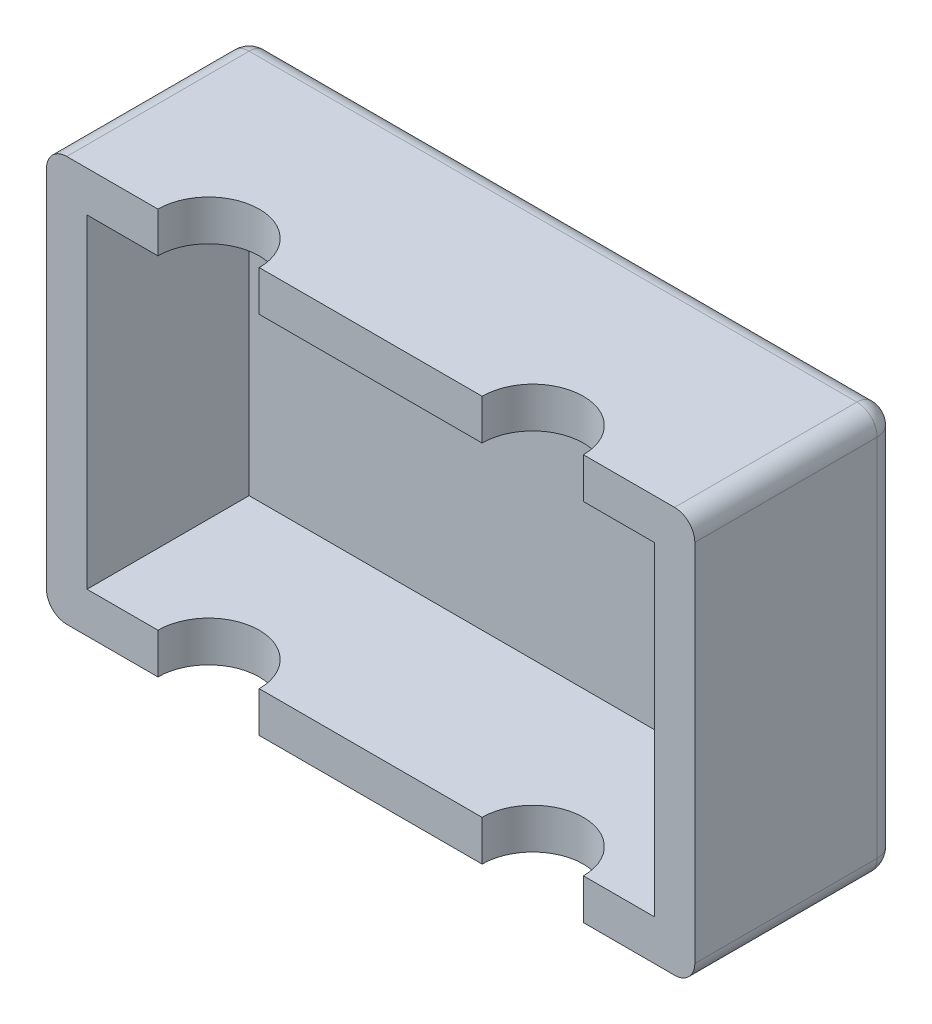
ISO-10303-21;
HEADER;
FILE_DESCRIPTION(('STEP AP214'),'2;1');
FILE_NAME('part.step','',(''),(''),'','','');
FILE_SCHEMA(('AUTOMOTIVE_DESIGN { 1 0 10303 214 1 1 1 1 }'));
ENDSEC;
DATA;
#1=APPLICATION_CONTEXT('core data for automotive mechanical design processes');
#2=APPLICATION_PROTOCOL_DEFINITION('international standard','automotive_design',2000,#1);
#3=PRODUCT_CONTEXT('',#1,'mechanical');
#4=PRODUCT('Part','Part','',(#3));
#5=PRODUCT_RELATED_PRODUCT_CATEGORY('part','',(#4));
#6=PRODUCT_DEFINITION_FORMATION('','',#4);
#7=PRODUCT_DEFINITION_CONTEXT('part definition',#1,'design');
#8=PRODUCT_DEFINITION('design','',#6,#7);
#9=PRODUCT_DEFINITION_SHAPE('','',#8);
#10=(LENGTH_UNIT() NAMED_UNIT(*) SI_UNIT(.MILLI.,.METRE.));
#11=(NAMED_UNIT(*) PLANE_ANGLE_UNIT() SI_UNIT($,.RADIAN.));
#12=(NAMED_UNIT(*) SI_UNIT($,.STERADIAN.) SOLID_ANGLE_UNIT());
#13=UNCERTAINTY_MEASURE_WITH_UNIT(LENGTH_MEASURE(1.E-05),#10,'distance_accuracy_value','');
#14=(GEOMETRIC_REPRESENTATION_CONTEXT(3) GLOBAL_UNCERTAINTY_ASSIGNED_CONTEXT((#13)) GLOBAL_UNIT_ASSIGNED_CONTEXT((#10,
#11,#12)) REPRESENTATION_CONTEXT('',''));
#15=CARTESIAN_POINT('',(0.,0.,0.));
#16=DIRECTION('',(0.,0.,1.));
#17=DIRECTION('',(1.,0.,0.));
#18=AXIS2_PLACEMENT_3D('',#15,#16,#17);
#19=CARTESIAN_POINT('',(-30.,-18.,20.));
#20=DIRECTION('',(0.,0.,1.));
#21=DIRECTION('',(1.,0.,0.));
#22=AXIS2_PLACEMENT_3D('',#19,#20,#21);
#23=PLANE('',#22);
#24=DIRECTION('',(0.,1.,0.));
#25=VECTOR('',#24,1.);
#26=CARTESIAN_POINT('',(21.,-20.,20.));
#27=LINE('',#26,#25);
#28=CARTESIAN_POINT('',(21.,-20.,20.));
#29=VERTEX_POINT('',#28);
#30=CARTESIAN_POINT('',(21.,-16.,20.));
#31=VERTEX_POINT('',#30);
#32=EDGE_CURVE('E48',#29,#31,#27,.T.);
#33=ORIENTED_EDGE('',*,*,#32,.F.);
#34=DIRECTION('',(1.,0.,0.));
#35=VECTOR('',#34,1.);
#36=CARTESIAN_POINT('',(-30.,-20.,20.));
#37=LINE('',#36,#35);
#38=CARTESIAN_POINT('',(30.,-20.,20.));
#39=VERTEX_POINT('',#38);
#40=EDGE_CURVE('E191',#29,#39,#37,.T.);
#41=ORIENTED_EDGE('',*,*,#40,.T.);
#42=CARTESIAN_POINT('',(30.,-18.,20.));
#43=DIRECTION('',(0.,0.,1.));
#44=DIRECTION('',(1.,0.,0.));
#45=AXIS2_PLACEMENT_3D('',#42,#43,#44);
#46=CIRCLE('',#45,2.);
#47=CARTESIAN_POINT('',(32.,-18.,20.));
#48=VERTEX_POINT('',#47);
#49=EDGE_CURVE('E211',#39,#48,#46,.T.);
#50=ORIENTED_EDGE('',*,*,#49,.T.);
#51=DIRECTION('',(0.,1.,0.));
#52=VECTOR('',#51,1.);
#53=CARTESIAN_POINT('',(32.,18.,20.));
#54=LINE('',#53,#52);
#55=CARTESIAN_POINT('',(32.,18.,20.));
#56=VERTEX_POINT('',#55);
#57=EDGE_CURVE('E214',#48,#56,#54,.T.);
#58=ORIENTED_EDGE('',*,*,#57,.T.);
#59=CARTESIAN_POINT('',(30.,18.,20.));
#60=DIRECTION('',(0.,0.,1.));
#61=DIRECTION('',(-1.,0.,0.));
#62=AXIS2_PLACEMENT_3D('',#59,#60,#61);
#63=CIRCLE('',#62,2.);
#64=CARTESIAN_POINT('',(30.,20.,20.));
#65=VERTEX_POINT('',#64);
#66=EDGE_CURVE('E216',#56,#65,#63,.T.);
#67=ORIENTED_EDGE('',*,*,#66,.T.);
#68=DIRECTION('',(-1.,0.,0.));
#69=VECTOR('',#68,1.);
#70=CARTESIAN_POINT('',(-30.,20.,20.));
#71=LINE('',#70,#69);
#72=CARTESIAN_POINT('',(21.,20.,20.));
#73=VERTEX_POINT('',#72);
#74=EDGE_CURVE('E221',#65,#73,#71,.T.);
#75=ORIENTED_EDGE('',*,*,#74,.T.);
#76=CARTESIAN_POINT('',(21.,16.,20.));
#77=VERTEX_POINT('',#76);
#78=EDGE_CURVE('E197',#77,#73,#27,.T.);
#79=ORIENTED_EDGE('',*,*,#78,.F.);
#80=DIRECTION('',(-1.,0.,0.));
#81=VECTOR('',#80,1.);
#82=CARTESIAN_POINT('',(-30.,16.,20.));
#83=LINE('',#82,#81);
#84=CARTESIAN_POINT('',(28.,16.,20.));
#85=VERTEX_POINT('',#84);
#86=EDGE_CURVE('E444',#85,#77,#83,.T.);
#87=ORIENTED_EDGE('',*,*,#86,.F.);
#88=DIRECTION('',(0.,1.,0.));
#89=VECTOR('',#88,1.);
#90=CARTESIAN_POINT('',(28.,18.,20.));
#91=LINE('',#90,#89);
#92=CARTESIAN_POINT('',(28.,-16.,20.));
#93=VERTEX_POINT('',#92);
#94=EDGE_CURVE('E436',#93,#85,#91,.T.);
#95=ORIENTED_EDGE('',*,*,#94,.F.);
#96=DIRECTION('',(1.,0.,0.));
#97=VECTOR('',#96,1.);
#98=CARTESIAN_POINT('',(-30.,-16.,20.));
#99=LINE('',#98,#97);
#100=EDGE_CURVE('E194',#31,#93,#99,.T.);
#101=ORIENTED_EDGE('',*,*,#100,.F.);
#102=EDGE_LOOP('',(#33,#41,#50,#58,#67,#75,#79,#87,#95,#101));
#103=FACE_BOUND('',#102,.T.);
#104=ADVANCED_FACE('F33',(#103),#23,.T.);
#105=DIRECTION('',(0.,1.,0.));
#106=VECTOR('',#105,1.);
#107=CARTESIAN_POINT('',(11.,-20.,20.));
#108=LINE('',#107,#106);
#109=CARTESIAN_POINT('',(11.,20.,20.));
#110=VERTEX_POINT('',#109);
#111=CARTESIAN_POINT('',(11.,16.,20.));
#112=VERTEX_POINT('',#111);
#113=EDGE_CURVE('E55',#110,#112,#108,.F.);
#114=ORIENTED_EDGE('',*,*,#113,.F.);
#115=CARTESIAN_POINT('',(-11.,20.,20.));
#116=VERTEX_POINT('',#115);
#117=EDGE_CURVE('E225',#110,#116,#71,.T.);
#118=ORIENTED_EDGE('',*,*,#117,.T.);
#119=DIRECTION('',(0.,1.,0.));
#120=VECTOR('',#119,1.);
#121=CARTESIAN_POINT('',(-11.,-20.,20.));
#122=LINE('',#121,#120);
#123=CARTESIAN_POINT('',(-11.,16.,20.));
#124=VERTEX_POINT('',#123);
#125=EDGE_CURVE('E304',#124,#116,#122,.T.);
#126=ORIENTED_EDGE('',*,*,#125,.F.);
#127=EDGE_CURVE('E313',#112,#124,#83,.T.);
#128=ORIENTED_EDGE('',*,*,#127,.F.);
#129=EDGE_LOOP('',(#114,#118,#126,#128));
#130=FACE_BOUND('',#129,.T.);
#131=ADVANCED_FACE('F312',(#130),#23,.T.);
#132=CARTESIAN_POINT('',(11.,-16.,20.));
#133=VERTEX_POINT('',#132);
#134=CARTESIAN_POINT('',(11.,-20.,20.));
#135=VERTEX_POINT('',#134);
#136=EDGE_CURVE('E182',#133,#135,#108,.F.);
#137=ORIENTED_EDGE('',*,*,#136,.F.);
#138=CARTESIAN_POINT('',(-11.,-16.,20.));
#139=VERTEX_POINT('',#138);
#140=EDGE_CURVE('E325',#139,#133,#99,.T.);
#141=ORIENTED_EDGE('',*,*,#140,.F.);
#142=CARTESIAN_POINT('',(-11.,-20.,20.));
#143=VERTEX_POINT('',#142);
#144=EDGE_CURVE('E317',#143,#139,#122,.T.);
#145=ORIENTED_EDGE('',*,*,#144,.F.);
#146=EDGE_CURVE('E202',#143,#135,#37,.T.);
#147=ORIENTED_EDGE('',*,*,#146,.T.);
#148=EDGE_LOOP('',(#137,#141,#145,#147));
#149=FACE_BOUND('',#148,.T.);
#150=ADVANCED_FACE('F416',(#149),#23,.T.);
#151=CARTESIAN_POINT('',(-30.,-18.,20.));
#152=DIRECTION('',(0.,0.,-1.));
#153=DIRECTION('',(-1.,0.,0.));
#154=AXIS2_PLACEMENT_3D('',#151,#152,#153);
#155=CYLINDRICAL_SURFACE('',#154,2.);
#156=DIRECTION('',(0.,0.,-1.));
#157=VECTOR('',#156,1.);
#158=CARTESIAN_POINT('',(-32.,-18.,20.));
#159=LINE('',#158,#157);
#160=CARTESIAN_POINT('',(-32.,-18.,20.));
#161=VERTEX_POINT('',#160);
#162=CARTESIAN_POINT('',(-32.,-18.,2.));
#163=VERTEX_POINT('',#162);
#164=EDGE_CURVE('E229',#161,#163,#159,.T.);
#165=ORIENTED_EDGE('',*,*,#164,.T.);
#166=CARTESIAN_POINT('',(-30.,-18.,2.));
#167=DIRECTION('',(0.,0.,-1.));
#168=DIRECTION('',(-1.,0.,0.));
#169=AXIS2_PLACEMENT_3D('',#166,#167,#168);
#170=CIRCLE('',#169,2.);
#171=CARTESIAN_POINT('',(-30.,-20.,2.));
#172=VERTEX_POINT('',#171);
#173=EDGE_CURVE('E269',#163,#172,#170,.F.);
#174=ORIENTED_EDGE('',*,*,#173,.T.);
#175=DIRECTION('',(0.,0.,-1.));
#176=VECTOR('',#175,1.);
#177=CARTESIAN_POINT('',(-30.,-20.,20.));
#178=LINE('',#177,#176);
#179=CARTESIAN_POINT('',(-30.,-20.,20.));
#180=VERTEX_POINT('',#179);
#181=EDGE_CURVE('E248',#180,#172,#178,.T.);
#182=ORIENTED_EDGE('',*,*,#181,.F.);
#183=CARTESIAN_POINT('',(-30.,-18.,20.));
#184=DIRECTION('',(0.,0.,1.));
#185=DIRECTION('',(1.,0.,0.));
#186=AXIS2_PLACEMENT_3D('',#183,#184,#185);
#187=CIRCLE('',#186,2.);
#188=EDGE_CURVE('E203',#161,#180,#187,.T.);
#189=ORIENTED_EDGE('',*,*,#188,.F.);
#190=EDGE_LOOP('',(#165,#174,#182,#189));
#191=FACE_BOUND('',#190,.T.);
#192=ADVANCED_FACE('F358',(#191),#155,.T.);
#193=CARTESIAN_POINT('',(-30.,-20.,20.));
#194=DIRECTION('',(0.,1.,0.));
#195=DIRECTION('',(0.,0.,1.));
#196=AXIS2_PLACEMENT_3D('',#193,#194,#195);
#197=PLANE('',#196);
#198=ORIENTED_EDGE('',*,*,#40,.F.);
#199=CARTESIAN_POINT('',(16.,-20.,20.));
#200=DIRECTION('',(0.,1.,0.));
#201=DIRECTION('',(0.,0.,1.));
#202=AXIS2_PLACEMENT_3D('',#199,#200,#201);
#203=CIRCLE('',#202,5.);
#204=EDGE_CURVE('E179',#29,#135,#203,.T.);
#205=ORIENTED_EDGE('',*,*,#204,.T.);
#206=ORIENTED_EDGE('',*,*,#146,.F.);
#207=CARTESIAN_POINT('',(-16.,-20.,20.));
#208=DIRECTION('',(0.,1.,0.));
#209=DIRECTION('',(0.,0.,1.));
#210=AXIS2_PLACEMENT_3D('',#207,#208,#209);
#211=CIRCLE('',#210,5.);
#212=CARTESIAN_POINT('',(-21.,-20.,20.));
#213=VERTEX_POINT('',#212);
#214=EDGE_CURVE('E320',#143,#213,#211,.T.);
#215=ORIENTED_EDGE('',*,*,#214,.T.);
#216=EDGE_CURVE('E205',#180,#213,#37,.T.);
#217=ORIENTED_EDGE('',*,*,#216,.F.);
#218=ORIENTED_EDGE('',*,*,#181,.T.);
#219=DIRECTION('',(1.,0.,0.));
#220=VECTOR('',#219,1.);
#221=CARTESIAN_POINT('',(-30.,-20.,2.));
#222=LINE('',#221,#220);
#223=CARTESIAN_POINT('',(30.,-20.,2.));
#224=VERTEX_POINT('',#223);
#225=EDGE_CURVE('E267',#172,#224,#222,.T.);
#226=ORIENTED_EDGE('',*,*,#225,.T.);
#227=DIRECTION('',(0.,0.,-1.));
#228=VECTOR('',#227,1.);
#229=CARTESIAN_POINT('',(30.,-20.,20.));
#230=LINE('',#229,#228);
#231=EDGE_CURVE('E200',#39,#224,#230,.T.);
#232=ORIENTED_EDGE('',*,*,#231,.F.);
#233=EDGE_LOOP('',(#198,#205,#206,#215,#217,#218,#226,#232));
#234=FACE_BOUND('',#233,.T.);
#235=ADVANCED_FACE('F198',(#234),#197,.F.);
#236=CARTESIAN_POINT('',(30.,-18.,20.));
#237=DIRECTION('',(0.,0.,-1.));
#238=DIRECTION('',(-1.,0.,0.));
#239=AXIS2_PLACEMENT_3D('',#236,#237,#238);
#240=CYLINDRICAL_SURFACE('',#239,2.);
#241=ORIENTED_EDGE('',*,*,#231,.T.);
#242=CARTESIAN_POINT('',(30.,-18.,2.));
#243=DIRECTION('',(0.,0.,-1.));
#244=DIRECTION('',(-1.,0.,0.));
#245=AXIS2_PLACEMENT_3D('',#242,#243,#244);
#246=CIRCLE('',#245,2.);
#247=CARTESIAN_POINT('',(32.,-18.,2.));
#248=VERTEX_POINT('',#247);
#249=EDGE_CURVE('E265',#224,#248,#246,.F.);
#250=ORIENTED_EDGE('',*,*,#249,.T.);
#251=DIRECTION('',(0.,0.,-1.));
#252=VECTOR('',#251,1.);
#253=CARTESIAN_POINT('',(32.,-18.,20.));
#254=LINE('',#253,#252);
#255=EDGE_CURVE('E244',#48,#248,#254,.T.);
#256=ORIENTED_EDGE('',*,*,#255,.F.);
#257=ORIENTED_EDGE('',*,*,#49,.F.);
#258=EDGE_LOOP('',(#241,#250,#256,#257));
#259=FACE_BOUND('',#258,.T.);
#260=ADVANCED_FACE('F375',(#259),#240,.T.);
#261=CARTESIAN_POINT('',(32.,18.,20.));
#262=DIRECTION('',(-1.,0.,0.));
#263=DIRECTION('',(0.,-1.,0.));
#264=AXIS2_PLACEMENT_3D('',#261,#262,#263);
#265=PLANE('',#264);
#266=ORIENTED_EDGE('',*,*,#255,.T.);
#267=DIRECTION('',(0.,1.,0.));
#268=VECTOR('',#267,1.);
#269=CARTESIAN_POINT('',(32.,18.,2.));
#270=LINE('',#269,#268);
#271=CARTESIAN_POINT('',(32.,18.,2.));
#272=VERTEX_POINT('',#271);
#273=EDGE_CURVE('E254',#248,#272,#270,.T.);
#274=ORIENTED_EDGE('',*,*,#273,.T.);
#275=DIRECTION('',(0.,0.,-1.));
#276=VECTOR('',#275,1.);
#277=CARTESIAN_POINT('',(32.,18.,20.));
#278=LINE('',#277,#276);
#279=EDGE_CURVE('E241',#56,#272,#278,.T.);
#280=ORIENTED_EDGE('',*,*,#279,.F.);
#281=ORIENTED_EDGE('',*,*,#57,.F.);
#282=EDGE_LOOP('',(#266,#274,#280,#281));
#283=FACE_BOUND('',#282,.T.);
#284=ADVANCED_FACE('F378',(#283),#265,.F.);
#285=CARTESIAN_POINT('',(30.,18.,20.));
#286=DIRECTION('',(0.,0.,-1.));
#287=DIRECTION('',(-1.,0.,0.));
#288=AXIS2_PLACEMENT_3D('',#285,#286,#287);
#289=CYLINDRICAL_SURFACE('',#288,2.);
#290=ORIENTED_EDGE('',*,*,#279,.T.);
#291=CARTESIAN_POINT('',(30.,18.,2.));
#292=DIRECTION('',(0.,0.,-1.));
#293=DIRECTION('',(-1.,0.,0.));
#294=AXIS2_PLACEMENT_3D('',#291,#292,#293);
#295=CIRCLE('',#294,2.);
#296=CARTESIAN_POINT('',(30.,20.,2.));
#297=VERTEX_POINT('',#296);
#298=EDGE_CURVE('E251',#272,#297,#295,.F.);
#299=ORIENTED_EDGE('',*,*,#298,.T.);
#300=DIRECTION('',(0.,0.,-1.));
#301=VECTOR('',#300,1.);
#302=CARTESIAN_POINT('',(30.,20.,20.));
#303=LINE('',#302,#301);
#304=EDGE_CURVE('E238',#65,#297,#303,.T.);
#305=ORIENTED_EDGE('',*,*,#304,.F.);
#306=ORIENTED_EDGE('',*,*,#66,.F.);
#307=EDGE_LOOP('',(#290,#299,#305,#306));
#308=FACE_BOUND('',#307,.T.);
#309=ADVANCED_FACE('F383',(#308),#289,.T.);
#310=CARTESIAN_POINT('',(-30.,20.,20.));
#311=DIRECTION('',(0.,-1.,0.));
#312=DIRECTION('',(0.,0.,-1.));
#313=AXIS2_PLACEMENT_3D('',#310,#311,#312);
#314=PLANE('',#313);
#315=ORIENTED_EDGE('',*,*,#117,.F.);
#316=CARTESIAN_POINT('',(16.,20.,20.));
#317=DIRECTION('',(0.,1.,0.));
#318=DIRECTION('',(0.,0.,1.));
#319=AXIS2_PLACEMENT_3D('',#316,#317,#318);
#320=CIRCLE('',#319,5.);
#321=EDGE_CURVE('E187',#73,#110,#320,.T.);
#322=ORIENTED_EDGE('',*,*,#321,.F.);
#323=ORIENTED_EDGE('',*,*,#74,.F.);
#324=ORIENTED_EDGE('',*,*,#304,.T.);
#325=DIRECTION('',(-1.,0.,0.));
#326=VECTOR('',#325,1.);
#327=CARTESIAN_POINT('',(-30.,20.,2.));
#328=LINE('',#327,#326);
#329=CARTESIAN_POINT('',(-30.,20.,2.));
#330=VERTEX_POINT('',#329);
#331=EDGE_CURVE('E275',#297,#330,#328,.T.);
#332=ORIENTED_EDGE('',*,*,#331,.T.);
#333=DIRECTION('',(0.,0.,-1.));
#334=VECTOR('',#333,1.);
#335=CARTESIAN_POINT('',(-30.,20.,20.));
#336=LINE('',#335,#334);
#337=CARTESIAN_POINT('',(-30.,20.,20.));
#338=VERTEX_POINT('',#337);
#339=EDGE_CURVE('E235',#338,#330,#336,.T.);
#340=ORIENTED_EDGE('',*,*,#339,.F.);
#341=CARTESIAN_POINT('',(-21.,20.,20.));
#342=VERTEX_POINT('',#341);
#343=EDGE_CURVE('E220',#342,#338,#71,.T.);
#344=ORIENTED_EDGE('',*,*,#343,.F.);
#345=CARTESIAN_POINT('',(-16.,20.,20.));
#346=DIRECTION('',(0.,1.,0.));
#347=DIRECTION('',(0.,0.,1.));
#348=AXIS2_PLACEMENT_3D('',#345,#346,#347);
#349=CIRCLE('',#348,5.);
#350=EDGE_CURVE('E195',#116,#342,#349,.T.);
#351=ORIENTED_EDGE('',*,*,#350,.F.);
#352=EDGE_LOOP('',(#315,#322,#323,#324,#332,#340,#344,#351));
#353=FACE_BOUND('',#352,.T.);
#354=ADVANCED_FACE('F340',(#353),#314,.F.);
#355=CARTESIAN_POINT('',(-30.,18.,20.));
#356=DIRECTION('',(0.,0.,-1.));
#357=DIRECTION('',(-1.,0.,0.));
#358=AXIS2_PLACEMENT_3D('',#355,#356,#357);
#359=CYLINDRICAL_SURFACE('',#358,2.);
#360=ORIENTED_EDGE('',*,*,#339,.T.);
#361=CARTESIAN_POINT('',(-30.,18.,2.));
#362=DIRECTION('',(0.,0.,-1.));
#363=DIRECTION('',(-1.,0.,0.));
#364=AXIS2_PLACEMENT_3D('',#361,#362,#363);
#365=CIRCLE('',#364,2.);
#366=CARTESIAN_POINT('',(-32.,18.,2.));
#367=VERTEX_POINT('',#366);
#368=EDGE_CURVE('E273',#330,#367,#365,.F.);
#369=ORIENTED_EDGE('',*,*,#368,.T.);
#370=DIRECTION('',(0.,0.,-1.));
#371=VECTOR('',#370,1.);
#372=CARTESIAN_POINT('',(-32.,18.,20.));
#373=LINE('',#372,#371);
#374=CARTESIAN_POINT('',(-32.,18.,20.));
#375=VERTEX_POINT('',#374);
#376=EDGE_CURVE('E232',#375,#367,#373,.T.);
#377=ORIENTED_EDGE('',*,*,#376,.F.);
#378=CARTESIAN_POINT('',(-30.,18.,20.));
#379=DIRECTION('',(0.,0.,1.));
#380=DIRECTION('',(1.,0.,0.));
#381=AXIS2_PLACEMENT_3D('',#378,#379,#380);
#382=CIRCLE('',#381,2.);
#383=EDGE_CURVE('E224',#338,#375,#382,.T.);
#384=ORIENTED_EDGE('',*,*,#383,.F.);
#385=EDGE_LOOP('',(#360,#369,#377,#384));
#386=FACE_BOUND('',#385,.T.);
#387=ADVANCED_FACE('F349',(#386),#359,.T.);
#388=CARTESIAN_POINT('',(-32.,18.,20.));
#389=DIRECTION('',(1.,0.,0.));
#390=DIRECTION('',(0.,1.,0.));
#391=AXIS2_PLACEMENT_3D('',#388,#389,#390);
#392=PLANE('',#391);
#393=ORIENTED_EDGE('',*,*,#376,.T.);
#394=DIRECTION('',(0.,-1.,0.));
#395=VECTOR('',#394,1.);
#396=CARTESIAN_POINT('',(-32.,18.,2.));
#397=LINE('',#396,#395);
#398=EDGE_CURVE('E271',#367,#163,#397,.T.);
#399=ORIENTED_EDGE('',*,*,#398,.T.);
#400=ORIENTED_EDGE('',*,*,#164,.F.);
#401=DIRECTION('',(0.,-1.,0.));
#402=VECTOR('',#401,1.);
#403=CARTESIAN_POINT('',(-32.,18.,20.));
#404=LINE('',#403,#402);
#405=EDGE_CURVE('E227',#375,#161,#404,.T.);
#406=ORIENTED_EDGE('',*,*,#405,.F.);
#407=EDGE_LOOP('',(#393,#399,#400,#406));
#408=FACE_BOUND('',#407,.T.);
#409=ADVANCED_FACE('F354',(#408),#392,.F.);
#410=DIRECTION('',(0.,1.,0.));
#411=VECTOR('',#410,1.);
#412=CARTESIAN_POINT('',(-21.,-20.,20.));
#413=LINE('',#412,#411);
#414=CARTESIAN_POINT('',(-21.,16.,20.));
#415=VERTEX_POINT('',#414);
#416=EDGE_CURVE('E307',#342,#415,#413,.F.);
#417=ORIENTED_EDGE('',*,*,#416,.F.);
#418=ORIENTED_EDGE('',*,*,#343,.T.);
#419=ORIENTED_EDGE('',*,*,#383,.T.);
#420=ORIENTED_EDGE('',*,*,#405,.T.);
#421=ORIENTED_EDGE('',*,*,#188,.T.);
#422=ORIENTED_EDGE('',*,*,#216,.T.);
#423=CARTESIAN_POINT('',(-21.,-16.,20.));
#424=VERTEX_POINT('',#423);
#425=EDGE_CURVE('E318',#424,#213,#413,.F.);
#426=ORIENTED_EDGE('',*,*,#425,.F.);
#427=CARTESIAN_POINT('',(-28.,-16.,20.));
#428=VERTEX_POINT('',#427);
#429=EDGE_CURVE('E327',#428,#424,#99,.T.);
#430=ORIENTED_EDGE('',*,*,#429,.F.);
#431=DIRECTION('',(0.,-1.,0.));
#432=VECTOR('',#431,1.);
#433=CARTESIAN_POINT('',(-28.,18.,20.));
#434=LINE('',#433,#432);
#435=CARTESIAN_POINT('',(-28.,16.,20.));
#436=VERTEX_POINT('',#435);
#437=EDGE_CURVE('E447',#436,#428,#434,.T.);
#438=ORIENTED_EDGE('',*,*,#437,.F.);
#439=EDGE_CURVE('E443',#415,#436,#83,.T.);
#440=ORIENTED_EDGE('',*,*,#439,.F.);
#441=EDGE_LOOP('',(#417,#418,#419,#420,#421,#422,#426,#430,#438,#440));
#442=FACE_BOUND('',#441,.T.);
#443=ADVANCED_FACE('F343',(#442),#23,.T.);
#444=CARTESIAN_POINT('',(-30.,-18.,0.));
#445=DIRECTION('',(0.,0.,1.));
#446=DIRECTION('',(1.,0.,0.));
#447=AXIS2_PLACEMENT_3D('',#444,#445,#446);
#448=PLANE('',#447);
#449=DIRECTION('',(-1.,0.,0.));
#450=VECTOR('',#449,1.);
#451=CARTESIAN_POINT('',(-30.,18.,0.));
#452=LINE('',#451,#450);
#453=CARTESIAN_POINT('',(-30.,18.,0.));
#454=VERTEX_POINT('',#453);
#455=CARTESIAN_POINT('',(30.,18.,0.));
#456=VERTEX_POINT('',#455);
#457=EDGE_CURVE('E256',#454,#456,#452,.F.);
#458=ORIENTED_EDGE('',*,*,#457,.T.);
#459=DIRECTION('',(0.,1.,0.));
#460=VECTOR('',#459,1.);
#461=CARTESIAN_POINT('',(30.,-18.,0.));
#462=LINE('',#461,#460);
#463=CARTESIAN_POINT('',(30.,-18.,0.));
#464=VERTEX_POINT('',#463);
#465=EDGE_CURVE('E262',#456,#464,#462,.F.);
#466=ORIENTED_EDGE('',*,*,#465,.T.);
#467=DIRECTION('',(1.,0.,0.));
#468=VECTOR('',#467,1.);
#469=CARTESIAN_POINT('',(-30.,-18.,0.));
#470=LINE('',#469,#468);
#471=CARTESIAN_POINT('',(-30.,-18.,0.));
#472=VERTEX_POINT('',#471);
#473=EDGE_CURVE('E260',#464,#472,#470,.F.);
#474=ORIENTED_EDGE('',*,*,#473,.T.);
#475=DIRECTION('',(0.,-1.,0.));
#476=VECTOR('',#475,1.);
#477=CARTESIAN_POINT('',(-30.,-18.,0.));
#478=LINE('',#477,#476);
#479=EDGE_CURVE('E258',#472,#454,#478,.F.);
#480=ORIENTED_EDGE('',*,*,#479,.T.);
#481=EDGE_LOOP('',(#458,#466,#474,#480));
#482=FACE_BOUND('',#481,.T.);
#483=ADVANCED_FACE('F399',(#482),#448,.F.);
#484=CARTESIAN_POINT('',(-30.,-18.,2.));
#485=DIRECTION('',(0.,0.,1.));
#486=DIRECTION('',(1.,0.,0.));
#487=AXIS2_PLACEMENT_3D('',#484,#485,#486);
#488=SPHERICAL_SURFACE('',#487,2.);
#489=CARTESIAN_POINT('',(-30.,-18.,2.));
#490=DIRECTION('',(0.,1.,0.));
#491=DIRECTION('',(0.,0.,1.));
#492=AXIS2_PLACEMENT_3D('',#489,#490,#491);
#493=CIRCLE('',#492,2.);
#494=EDGE_CURVE('E294',#472,#163,#493,.T.);
#495=ORIENTED_EDGE('',*,*,#494,.F.);
#496=CARTESIAN_POINT('',(-30.,-18.,2.));
#497=DIRECTION('',(1.,0.,0.));
#498=DIRECTION('',(0.,1.,0.));
#499=AXIS2_PLACEMENT_3D('',#496,#497,#498);
#500=CIRCLE('',#499,2.);
#501=EDGE_CURVE('E207',#172,#472,#500,.T.);
#502=ORIENTED_EDGE('',*,*,#501,.F.);
#503=ORIENTED_EDGE('',*,*,#173,.F.);
#504=EDGE_LOOP('',(#495,#502,#503));
#505=FACE_BOUND('',#504,.T.);
#506=ADVANCED_FACE('F35',(#505),#488,.T.);
#507=CARTESIAN_POINT('',(-30.,-18.,2.));
#508=DIRECTION('',(1.,0.,0.));
#509=DIRECTION('',(0.,0.,-1.));
#510=AXIS2_PLACEMENT_3D('',#507,#508,#509);
#511=CYLINDRICAL_SURFACE('',#510,2.);
#512=ORIENTED_EDGE('',*,*,#501,.T.);
#513=ORIENTED_EDGE('',*,*,#473,.F.);
#514=CARTESIAN_POINT('',(30.,-18.,2.));
#515=DIRECTION('',(1.,0.,0.));
#516=DIRECTION('',(0.,0.,-1.));
#517=AXIS2_PLACEMENT_3D('',#514,#515,#516);
#518=CIRCLE('',#517,2.);
#519=EDGE_CURVE('E291',#224,#464,#518,.T.);
#520=ORIENTED_EDGE('',*,*,#519,.F.);
#521=ORIENTED_EDGE('',*,*,#225,.F.);
#522=EDGE_LOOP('',(#512,#513,#520,#521));
#523=FACE_BOUND('',#522,.T.);
#524=ADVANCED_FACE('F368',(#523),#511,.T.);
#525=CARTESIAN_POINT('',(-30.,18.,2.));
#526=DIRECTION('',(0.,-1.,0.));
#527=DIRECTION('',(1.,0.,0.));
#528=AXIS2_PLACEMENT_3D('',#525,#526,#527);
#529=CYLINDRICAL_SURFACE('',#528,2.);
#530=ORIENTED_EDGE('',*,*,#494,.T.);
#531=ORIENTED_EDGE('',*,*,#398,.F.);
#532=CARTESIAN_POINT('',(-30.,18.,2.));
#533=DIRECTION('',(0.,1.,0.));
#534=DIRECTION('',(0.,0.,1.));
#535=AXIS2_PLACEMENT_3D('',#532,#533,#534);
#536=CIRCLE('',#535,2.);
#537=EDGE_CURVE('E288',#454,#367,#536,.T.);
#538=ORIENTED_EDGE('',*,*,#537,.F.);
#539=ORIENTED_EDGE('',*,*,#479,.F.);
#540=EDGE_LOOP('',(#530,#531,#538,#539));
#541=FACE_BOUND('',#540,.T.);
#542=ADVANCED_FACE('F397',(#541),#529,.T.);
#543=CARTESIAN_POINT('',(30.,-18.,2.));
#544=DIRECTION('',(0.,0.,1.));
#545=DIRECTION('',(1.,0.,0.));
#546=AXIS2_PLACEMENT_3D('',#543,#544,#545);
#547=SPHERICAL_SURFACE('',#546,2.);
#548=ORIENTED_EDGE('',*,*,#249,.F.);
#549=ORIENTED_EDGE('',*,*,#519,.T.);
#550=CARTESIAN_POINT('',(30.,-18.,2.));
#551=DIRECTION('',(0.,1.,0.));
#552=DIRECTION('',(0.,0.,1.));
#553=AXIS2_PLACEMENT_3D('',#550,#551,#552);
#554=CIRCLE('',#553,2.);
#555=EDGE_CURVE('E286',#248,#464,#554,.T.);
#556=ORIENTED_EDGE('',*,*,#555,.F.);
#557=EDGE_LOOP('',(#548,#549,#556));
#558=FACE_BOUND('',#557,.T.);
#559=ADVANCED_FACE('F372',(#558),#547,.T.);
#560=CARTESIAN_POINT('',(-30.,18.,2.));
#561=DIRECTION('',(0.,0.,1.));
#562=DIRECTION('',(1.,0.,0.));
#563=AXIS2_PLACEMENT_3D('',#560,#561,#562);
#564=SPHERICAL_SURFACE('',#563,2.);
#565=ORIENTED_EDGE('',*,*,#537,.T.);
#566=ORIENTED_EDGE('',*,*,#368,.F.);
#567=CARTESIAN_POINT('',(-30.,18.,2.));
#568=DIRECTION('',(1.,0.,0.));
#569=DIRECTION('',(0.,0.,-1.));
#570=AXIS2_PLACEMENT_3D('',#567,#568,#569);
#571=CIRCLE('',#570,2.);
#572=EDGE_CURVE('E283',#454,#330,#571,.T.);
#573=ORIENTED_EDGE('',*,*,#572,.F.);
#574=EDGE_LOOP('',(#565,#566,#573));
#575=FACE_BOUND('',#574,.T.);
#576=ADVANCED_FACE('F394',(#575),#564,.T.);
#577=CARTESIAN_POINT('',(30.,18.,2.));
#578=DIRECTION('',(0.,1.,0.));
#579=DIRECTION('',(-1.,0.,0.));
#580=AXIS2_PLACEMENT_3D('',#577,#578,#579);
#581=CYLINDRICAL_SURFACE('',#580,2.);
#582=ORIENTED_EDGE('',*,*,#555,.T.);
#583=ORIENTED_EDGE('',*,*,#465,.F.);
#584=CARTESIAN_POINT('',(30.,18.,2.));
#585=DIRECTION('',(0.,1.,0.));
#586=DIRECTION('',(0.,0.,1.));
#587=AXIS2_PLACEMENT_3D('',#584,#585,#586);
#588=CIRCLE('',#587,2.);
#589=EDGE_CURVE('E279',#272,#456,#588,.T.);
#590=ORIENTED_EDGE('',*,*,#589,.F.);
#591=ORIENTED_EDGE('',*,*,#273,.F.);
#592=EDGE_LOOP('',(#582,#583,#590,#591));
#593=FACE_BOUND('',#592,.T.);
#594=ADVANCED_FACE('F402',(#593),#581,.T.);
#595=CARTESIAN_POINT('',(-30.,18.,2.));
#596=DIRECTION('',(-1.,0.,0.));
#597=DIRECTION('',(0.,0.,1.));
#598=AXIS2_PLACEMENT_3D('',#595,#596,#597);
#599=CYLINDRICAL_SURFACE('',#598,2.);
#600=ORIENTED_EDGE('',*,*,#572,.T.);
#601=ORIENTED_EDGE('',*,*,#331,.F.);
#602=CARTESIAN_POINT('',(30.,18.,2.));
#603=DIRECTION('',(1.,0.,0.));
#604=DIRECTION('',(0.,0.,-1.));
#605=AXIS2_PLACEMENT_3D('',#602,#603,#604);
#606=CIRCLE('',#605,2.);
#607=EDGE_CURVE('E277',#456,#297,#606,.T.);
#608=ORIENTED_EDGE('',*,*,#607,.F.);
#609=ORIENTED_EDGE('',*,*,#457,.F.);
#610=EDGE_LOOP('',(#600,#601,#608,#609));
#611=FACE_BOUND('',#610,.T.);
#612=ADVANCED_FACE('F391',(#611),#599,.T.);
#613=CARTESIAN_POINT('',(30.,18.,2.));
#614=DIRECTION('',(0.,0.,1.));
#615=DIRECTION('',(1.,0.,0.));
#616=AXIS2_PLACEMENT_3D('',#613,#614,#615);
#617=SPHERICAL_SURFACE('',#616,2.);
#618=ORIENTED_EDGE('',*,*,#298,.F.);
#619=ORIENTED_EDGE('',*,*,#589,.T.);
#620=ORIENTED_EDGE('',*,*,#607,.T.);
#621=EDGE_LOOP('',(#618,#619,#620));
#622=FACE_BOUND('',#621,.T.);
#623=ADVANCED_FACE('F387',(#622),#617,.T.);
#624=CARTESIAN_POINT('',(-30.,-16.,20.));
#625=DIRECTION('',(0.,1.,0.));
#626=DIRECTION('',(0.,0.,1.));
#627=AXIS2_PLACEMENT_3D('',#624,#625,#626);
#628=PLANE('',#627);
#629=CARTESIAN_POINT('',(16.,-16.,20.));
#630=DIRECTION('',(0.,1.,0.));
#631=DIRECTION('',(0.,0.,1.));
#632=AXIS2_PLACEMENT_3D('',#629,#630,#631);
#633=CIRCLE('',#632,5.);
#634=EDGE_CURVE('E332',#31,#133,#633,.T.);
#635=ORIENTED_EDGE('',*,*,#634,.F.);
#636=ORIENTED_EDGE('',*,*,#100,.T.);
#637=DIRECTION('',(0.,0.,-1.));
#638=VECTOR('',#637,1.);
#639=CARTESIAN_POINT('',(28.,-16.,20.));
#640=LINE('',#639,#638);
#641=CARTESIAN_POINT('',(28.,-16.,4.));
#642=VERTEX_POINT('',#641);
#643=EDGE_CURVE('E458',#93,#642,#640,.T.);
#644=ORIENTED_EDGE('',*,*,#643,.T.);
#645=DIRECTION('',(-1.,0.,0.));
#646=VECTOR('',#645,1.);
#647=CARTESIAN_POINT('',(-30.,-16.,4.));
#648=LINE('',#647,#646);
#649=CARTESIAN_POINT('',(-28.,-16.,4.));
#650=VERTEX_POINT('',#649);
#651=EDGE_CURVE('E465',#642,#650,#648,.T.);
#652=ORIENTED_EDGE('',*,*,#651,.T.);
#653=DIRECTION('',(0.,0.,-1.));
#654=VECTOR('',#653,1.);
#655=CARTESIAN_POINT('',(-28.,-16.,20.));
#656=LINE('',#655,#654);
#657=EDGE_CURVE('E467',#428,#650,#656,.T.);
#658=ORIENTED_EDGE('',*,*,#657,.F.);
#659=ORIENTED_EDGE('',*,*,#429,.T.);
#660=CARTESIAN_POINT('',(-16.,-16.,20.));
#661=DIRECTION('',(0.,1.,0.));
#662=DIRECTION('',(0.,0.,1.));
#663=AXIS2_PLACEMENT_3D('',#660,#661,#662);
#664=CIRCLE('',#663,5.);
#665=EDGE_CURVE('E315',#139,#424,#664,.T.);
#666=ORIENTED_EDGE('',*,*,#665,.F.);
#667=ORIENTED_EDGE('',*,*,#140,.T.);
#668=EDGE_LOOP('',(#635,#636,#644,#652,#658,#659,#666,#667));
#669=FACE_BOUND('',#668,.T.);
#670=ADVANCED_FACE('F434',(#669),#628,.T.);
#671=CARTESIAN_POINT('',(28.,18.,20.));
#672=DIRECTION('',(-1.,0.,0.));
#673=DIRECTION('',(0.,-1.,0.));
#674=AXIS2_PLACEMENT_3D('',#671,#672,#673);
#675=PLANE('',#674);
#676=ORIENTED_EDGE('',*,*,#643,.F.);
#677=ORIENTED_EDGE('',*,*,#94,.T.);
#678=DIRECTION('',(0.,0.,-1.));
#679=VECTOR('',#678,1.);
#680=CARTESIAN_POINT('',(28.,16.,20.));
#681=LINE('',#680,#679);
#682=CARTESIAN_POINT('',(28.,16.,4.));
#683=VERTEX_POINT('',#682);
#684=EDGE_CURVE('E455',#85,#683,#681,.T.);
#685=ORIENTED_EDGE('',*,*,#684,.T.);
#686=DIRECTION('',(0.,-1.,0.));
#687=VECTOR('',#686,1.);
#688=CARTESIAN_POINT('',(28.,-18.,4.));
#689=LINE('',#688,#687);
#690=EDGE_CURVE('E462',#683,#642,#689,.T.);
#691=ORIENTED_EDGE('',*,*,#690,.T.);
#692=EDGE_LOOP('',(#676,#677,#685,#691));
#693=FACE_BOUND('',#692,.T.);
#694=ADVANCED_FACE('F477',(#693),#675,.T.);
#695=CARTESIAN_POINT('',(-30.,16.,20.));
#696=DIRECTION('',(0.,-1.,0.));
#697=DIRECTION('',(0.,0.,-1.));
#698=AXIS2_PLACEMENT_3D('',#695,#696,#697);
#699=PLANE('',#698);
#700=CARTESIAN_POINT('',(16.,16.,20.));
#701=DIRECTION('',(0.,-1.,0.));
#702=DIRECTION('',(0.,0.,-1.));
#703=AXIS2_PLACEMENT_3D('',#700,#701,#702);
#704=CIRCLE('',#703,5.);
#705=EDGE_CURVE('E11',#112,#77,#704,.T.);
#706=ORIENTED_EDGE('',*,*,#705,.F.);
#707=ORIENTED_EDGE('',*,*,#127,.T.);
#708=CARTESIAN_POINT('',(-16.,16.,20.));
#709=DIRECTION('',(0.,-1.,0.));
#710=DIRECTION('',(0.,0.,-1.));
#711=AXIS2_PLACEMENT_3D('',#708,#709,#710);
#712=CIRCLE('',#711,5.);
#713=EDGE_CURVE('E41',#415,#124,#712,.T.);
#714=ORIENTED_EDGE('',*,*,#713,.F.);
#715=ORIENTED_EDGE('',*,*,#439,.T.);
#716=DIRECTION('',(0.,0.,-1.));
#717=VECTOR('',#716,1.);
#718=CARTESIAN_POINT('',(-28.,16.,20.));
#719=LINE('',#718,#717);
#720=CARTESIAN_POINT('',(-28.,16.,4.));
#721=VERTEX_POINT('',#720);
#722=EDGE_CURVE('E448',#436,#721,#719,.T.);
#723=ORIENTED_EDGE('',*,*,#722,.T.);
#724=DIRECTION('',(-1.,0.,0.));
#725=VECTOR('',#724,1.);
#726=CARTESIAN_POINT('',(-30.,16.,4.));
#727=LINE('',#726,#725);
#728=EDGE_CURVE('E280',#683,#721,#727,.T.);
#729=ORIENTED_EDGE('',*,*,#728,.F.);
#730=ORIENTED_EDGE('',*,*,#684,.F.);
#731=ORIENTED_EDGE('',*,*,#86,.T.);
#732=EDGE_LOOP('',(#706,#707,#714,#715,#723,#729,#730,#731));
#733=FACE_BOUND('',#732,.T.);
#734=ADVANCED_FACE('F473',(#733),#699,.T.);
#735=CARTESIAN_POINT('',(-28.,18.,20.));
#736=DIRECTION('',(1.,0.,0.));
#737=DIRECTION('',(0.,1.,0.));
#738=AXIS2_PLACEMENT_3D('',#735,#736,#737);
#739=PLANE('',#738);
#740=ORIENTED_EDGE('',*,*,#722,.F.);
#741=ORIENTED_EDGE('',*,*,#437,.T.);
#742=ORIENTED_EDGE('',*,*,#657,.T.);
#743=DIRECTION('',(0.,-1.,0.));
#744=VECTOR('',#743,1.);
#745=CARTESIAN_POINT('',(-28.,18.,4.));
#746=LINE('',#745,#744);
#747=EDGE_CURVE('E439',#721,#650,#746,.T.);
#748=ORIENTED_EDGE('',*,*,#747,.F.);
#749=EDGE_LOOP('',(#740,#741,#742,#748));
#750=FACE_BOUND('',#749,.T.);
#751=ADVANCED_FACE('F470',(#750),#739,.T.);
#752=CARTESIAN_POINT('',(-30.,-18.,4.));
#753=DIRECTION('',(0.,0.,1.));
#754=DIRECTION('',(1.,0.,0.));
#755=AXIS2_PLACEMENT_3D('',#752,#753,#754);
#756=PLANE('',#755);
#757=ORIENTED_EDGE('',*,*,#728,.T.);
#758=ORIENTED_EDGE('',*,*,#747,.T.);
#759=ORIENTED_EDGE('',*,*,#651,.F.);
#760=ORIENTED_EDGE('',*,*,#690,.F.);
#761=EDGE_LOOP('',(#757,#758,#759,#760));
#762=FACE_BOUND('',#761,.T.);
#763=ADVANCED_FACE('F480',(#762),#756,.T.);
#764=CARTESIAN_POINT('',(-16.,-20.,20.));
#765=DIRECTION('',(0.,1.,0.));
#766=DIRECTION('',(0.,0.,1.));
#767=AXIS2_PLACEMENT_3D('',#764,#765,#766);
#768=CYLINDRICAL_SURFACE('',#767,5.);
#769=ORIENTED_EDGE('',*,*,#125,.T.);
#770=ORIENTED_EDGE('',*,*,#350,.T.);
#771=ORIENTED_EDGE('',*,*,#416,.T.);
#772=ORIENTED_EDGE('',*,*,#713,.T.);
#773=EDGE_LOOP('',(#769,#770,#771,#772));
#774=FACE_BOUND('',#773,.T.);
#775=ADVANCED_FACE('F303',(#774),#768,.F.);
#776=ORIENTED_EDGE('',*,*,#144,.T.);
#777=ORIENTED_EDGE('',*,*,#665,.T.);
#778=ORIENTED_EDGE('',*,*,#425,.T.);
#779=ORIENTED_EDGE('',*,*,#214,.F.);
#780=EDGE_LOOP('',(#776,#777,#778,#779));
#781=FACE_BOUND('',#780,.T.);
#782=ADVANCED_FACE('F486',(#781),#768,.F.);
#783=CARTESIAN_POINT('',(16.,-20.,20.));
#784=DIRECTION('',(0.,1.,0.));
#785=DIRECTION('',(0.,0.,1.));
#786=AXIS2_PLACEMENT_3D('',#783,#784,#785);
#787=CYLINDRICAL_SURFACE('',#786,5.);
#788=ORIENTED_EDGE('',*,*,#78,.T.);
#789=ORIENTED_EDGE('',*,*,#321,.T.);
#790=ORIENTED_EDGE('',*,*,#113,.T.);
#791=ORIENTED_EDGE('',*,*,#705,.T.);
#792=EDGE_LOOP('',(#788,#789,#790,#791));
#793=FACE_BOUND('',#792,.T.);
#794=ADVANCED_FACE('F336',(#793),#787,.F.);
#795=ORIENTED_EDGE('',*,*,#32,.T.);
#796=ORIENTED_EDGE('',*,*,#634,.T.);
#797=ORIENTED_EDGE('',*,*,#136,.T.);
#798=ORIENTED_EDGE('',*,*,#204,.F.);
#799=EDGE_LOOP('',(#795,#796,#797,#798));
#800=FACE_BOUND('',#799,.T.);
#801=ADVANCED_FACE('F180',(#800),#787,.F.);
#802=CLOSED_SHELL('',(#104,#131,#150,#192,#235,#260,#284,#309,#354,#387,#409,#443,#483,#506,
#524,#542,#559,#576,#594,#612,#623,#670,#694,#734,#751,#763,#775,#782,#794,#801));
#803=MANIFOLD_SOLID_BREP('B2',#802);
#804=ADVANCED_BREP_SHAPE_REPRESENTATION('',(#18,#803),#14);
#805=SHAPE_DEFINITION_REPRESENTATION(#9,#804);
ENDSEC;
END-ISO-10303-21;
